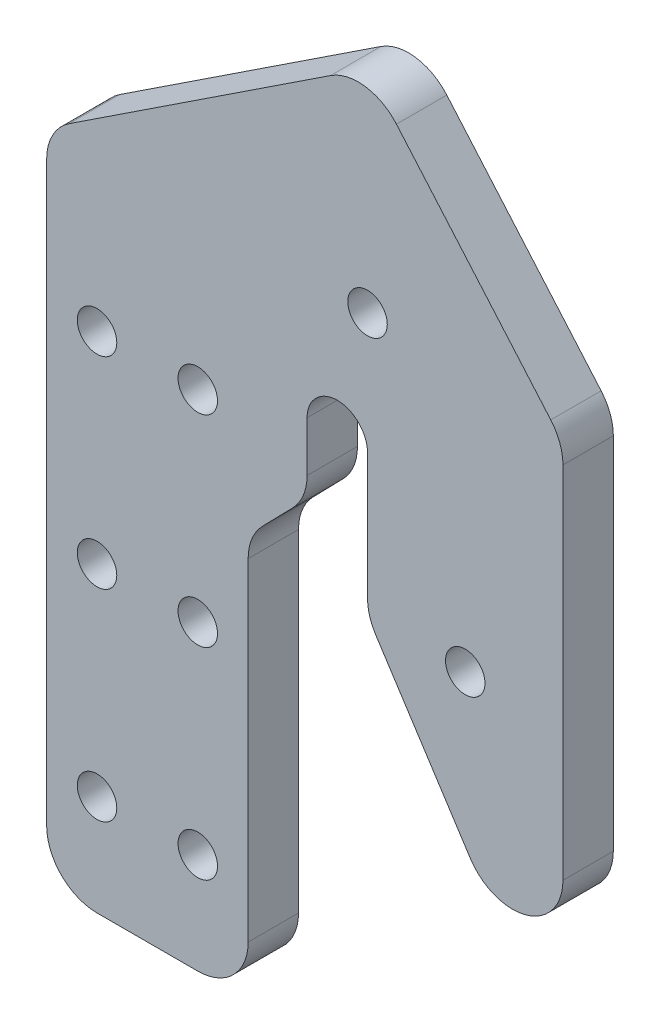
ISO-10303-21;
HEADER;
FILE_DESCRIPTION(('STEP AP214'),'2;1');
FILE_NAME('part.step','',(''),(''),'','','');
FILE_SCHEMA(('AUTOMOTIVE_DESIGN { 1 0 10303 214 1 1 1 1 }'));
ENDSEC;
DATA;
#1=APPLICATION_CONTEXT('core data for automotive mechanical design processes');
#2=APPLICATION_PROTOCOL_DEFINITION('international standard','automotive_design',2000,#1);
#3=PRODUCT_CONTEXT('',#1,'mechanical');
#4=PRODUCT('Part','Part','',(#3));
#5=PRODUCT_RELATED_PRODUCT_CATEGORY('part','',(#4));
#6=PRODUCT_DEFINITION_FORMATION('','',#4);
#7=PRODUCT_DEFINITION_CONTEXT('part definition',#1,'design');
#8=PRODUCT_DEFINITION('design','',#6,#7);
#9=PRODUCT_DEFINITION_SHAPE('','',#8);
#10=(LENGTH_UNIT() NAMED_UNIT(*) SI_UNIT(.MILLI.,.METRE.));
#11=(NAMED_UNIT(*) PLANE_ANGLE_UNIT() SI_UNIT($,.RADIAN.));
#12=(NAMED_UNIT(*) SI_UNIT($,.STERADIAN.) SOLID_ANGLE_UNIT());
#13=UNCERTAINTY_MEASURE_WITH_UNIT(LENGTH_MEASURE(1.E-05),#10,'distance_accuracy_value','');
#14=(GEOMETRIC_REPRESENTATION_CONTEXT(3) GLOBAL_UNCERTAINTY_ASSIGNED_CONTEXT((#13)) GLOBAL_UNIT_ASSIGNED_CONTEXT((#10,
#11,#12)) REPRESENTATION_CONTEXT('',''));
#15=CARTESIAN_POINT('',(0.,0.,0.));
#16=DIRECTION('',(0.,0.,1.));
#17=DIRECTION('',(1.,0.,0.));
#18=AXIS2_PLACEMENT_3D('',#15,#16,#17);
#19=CARTESIAN_POINT('',(0.,879.362720587149,6.35));
#20=DIRECTION('',(0.,1.,0.));
#21=DIRECTION('',(0.,0.,1.));
#22=AXIS2_PLACEMENT_3D('',#19,#20,#21);
#23=PLANE('',#22);
#24=DIRECTION('',(1.,0.,0.));
#25=VECTOR('',#24,1.);
#26=CARTESIAN_POINT('',(0.,879.362720587149,0.));
#27=LINE('',#26,#25);
#28=CARTESIAN_POINT('',(19.0500000000001,879.362720587149,0.));
#29=VERTEX_POINT('',#28);
#30=CARTESIAN_POINT('',(31.7500000000005,879.362720587149,0.));
#31=VERTEX_POINT('',#30);
#32=EDGE_CURVE('E247',#29,#31,#27,.T.);
#33=ORIENTED_EDGE('',*,*,#32,.T.);
#34=DIRECTION('',(0.,0.,-1.));
#35=VECTOR('',#34,1.);
#36=CARTESIAN_POINT('',(31.7500000000005,879.362720587149,6.35));
#37=LINE('',#36,#35);
#38=CARTESIAN_POINT('',(31.7500000000005,879.362720587149,6.35));
#39=VERTEX_POINT('',#38);
#40=EDGE_CURVE('E325',#31,#39,#37,.F.);
#41=ORIENTED_EDGE('',*,*,#40,.T.);
#42=DIRECTION('',(1.,0.,0.));
#43=VECTOR('',#42,1.);
#44=CARTESIAN_POINT('',(0.,879.362720587149,6.35));
#45=LINE('',#44,#43);
#46=CARTESIAN_POINT('',(19.0500000000001,879.362720587149,6.35));
#47=VERTEX_POINT('',#46);
#48=EDGE_CURVE('E300',#47,#39,#45,.T.);
#49=ORIENTED_EDGE('',*,*,#48,.F.);
#50=DIRECTION('',(0.,0.,-1.));
#51=VECTOR('',#50,1.);
#52=CARTESIAN_POINT('',(19.0500000000001,879.362720587149,6.35));
#53=LINE('',#52,#51);
#54=EDGE_CURVE('E322',#47,#29,#53,.T.);
#55=ORIENTED_EDGE('',*,*,#54,.T.);
#56=EDGE_LOOP('',(#33,#41,#49,#55));
#57=FACE_BOUND('',#56,.T.);
#58=ADVANCED_FACE('F39',(#57),#23,.F.);
#59=CARTESIAN_POINT('',(38.1000000000092,3.7470027081108E-13,6.35));
#60=DIRECTION('',(1.,0.,0.));
#61=DIRECTION('',(0.,1.,0.));
#62=AXIS2_PLACEMENT_3D('',#59,#60,#61);
#63=PLANE('',#62);
#64=DIRECTION('',(0.,-1.,0.));
#65=VECTOR('',#64,1.);
#66=CARTESIAN_POINT('',(38.1000000000092,3.7470027081108E-13,6.35));
#67=LINE('',#66,#65);
#68=CARTESIAN_POINT('',(38.1000000000001,927.579424839047,6.35));
#69=VERTEX_POINT('',#68);
#70=CARTESIAN_POINT('',(38.1000000000005,885.712720587149,6.35));
#71=VERTEX_POINT('',#70);
#72=EDGE_CURVE('E389',#69,#71,#67,.T.);
#73=ORIENTED_EDGE('',*,*,#72,.T.);
#74=DIRECTION('',(0.,0.,-1.));
#75=VECTOR('',#74,1.);
#76=CARTESIAN_POINT('',(38.1000000000005,885.712720587149,0.));
#77=LINE('',#76,#75);
#78=CARTESIAN_POINT('',(38.1000000000005,885.712720587149,0.));
#79=VERTEX_POINT('',#78);
#80=EDGE_CURVE('E303',#71,#79,#77,.T.);
#81=ORIENTED_EDGE('',*,*,#80,.T.);
#82=DIRECTION('',(0.,-1.,0.));
#83=VECTOR('',#82,1.);
#84=CARTESIAN_POINT('',(38.1000000000092,3.7470027081108E-13,0.));
#85=LINE('',#84,#83);
#86=CARTESIAN_POINT('',(38.1000000000001,927.579424839047,0.));
#87=VERTEX_POINT('',#86);
#88=EDGE_CURVE('E250',#87,#79,#85,.T.);
#89=ORIENTED_EDGE('',*,*,#88,.F.);
#90=DIRECTION('',(0.,0.,-1.));
#91=VECTOR('',#90,1.);
#92=CARTESIAN_POINT('',(38.1000000000001,927.579424839047,6.35));
#93=LINE('',#92,#91);
#94=EDGE_CURVE('E200',#87,#69,#93,.F.);
#95=ORIENTED_EDGE('',*,*,#94,.T.);
#96=EDGE_LOOP('',(#73,#81,#89,#95));
#97=FACE_BOUND('',#96,.T.);
#98=ADVANCED_FACE('F383',(#97),#63,.T.);
#99=CARTESIAN_POINT('',(-445.400142299249,434.265138741784,6.35));
#100=DIRECTION('',(-0.716000139620028,0.698100136129553,0.));
#101=DIRECTION('',(-0.698100136129553,-0.716000139620028,0.));
#102=AXIS2_PLACEMENT_3D('',#99,#100,#101);
#103=PLANE('',#102);
#104=DIRECTION('',(0.698100136129553,0.716000139620028,0.));
#105=VECTOR('',#104,1.);
#106=CARTESIAN_POINT('',(-445.400142299249,434.265138741784,6.35));
#107=LINE('',#106,#105);
#108=CARTESIAN_POINT('',(39.9033991134131,932.01236070347,6.35));
#109=VERTEX_POINT('',#108);
#110=CARTESIAN_POINT('',(43.7261008865876,935.933080470828,6.35));
#111=VERTEX_POINT('',#110);
#112=EDGE_CURVE('E190',#109,#111,#107,.T.);
#113=ORIENTED_EDGE('',*,*,#112,.F.);
#114=DIRECTION('',(0.,0.,-1.));
#115=VECTOR('',#114,1.);
#116=CARTESIAN_POINT('',(39.9033991134131,932.01236070347,6.35));
#117=LINE('',#116,#115);
#118=CARTESIAN_POINT('',(39.9033991134131,932.01236070347,0.));
#119=VERTEX_POINT('',#118);
#120=EDGE_CURVE('E347',#109,#119,#117,.T.);
#121=ORIENTED_EDGE('',*,*,#120,.T.);
#122=DIRECTION('',(0.698100136129553,0.716000139620028,0.));
#123=VECTOR('',#122,1.);
#124=CARTESIAN_POINT('',(-445.400142299249,434.265138741784,0.));
#125=LINE('',#124,#123);
#126=CARTESIAN_POINT('',(43.7261008865876,935.933080470828,0.));
#127=VERTEX_POINT('',#126);
#128=EDGE_CURVE('E253',#119,#127,#125,.T.);
#129=ORIENTED_EDGE('',*,*,#128,.T.);
#130=DIRECTION('',(0.,0.,-1.));
#131=VECTOR('',#130,1.);
#132=CARTESIAN_POINT('',(43.7261008865876,935.933080470828,6.35));
#133=LINE('',#132,#131);
#134=EDGE_CURVE('E345',#127,#111,#133,.F.);
#135=ORIENTED_EDGE('',*,*,#134,.T.);
#136=EDGE_LOOP('',(#113,#121,#129,#135));
#137=FACE_BOUND('',#136,.T.);
#138=ADVANCED_FACE('F391',(#137),#103,.F.);
#139=CARTESIAN_POINT('',(45.5295000000003,0.,6.35));
#140=DIRECTION('',(-1.,0.,0.));
#141=DIRECTION('',(0.,0.,1.));
#142=AXIS2_PLACEMENT_3D('',#139,#140,#141);
#143=PLANE('',#142);
#144=DIRECTION('',(0.,1.,0.));
#145=VECTOR('',#144,1.);
#146=CARTESIAN_POINT('',(45.5295000000003,0.,6.35));
#147=LINE('',#146,#145);
#148=CARTESIAN_POINT('',(45.5295000000003,940.36601633525,6.35));
#149=VERTEX_POINT('',#148);
#150=CARTESIAN_POINT('',(45.5295000000003,946.672720587149,6.35));
#151=VERTEX_POINT('',#150);
#152=EDGE_CURVE('E176',#149,#151,#147,.T.);
#153=ORIENTED_EDGE('',*,*,#152,.F.);
#154=DIRECTION('',(0.,0.,-1.));
#155=VECTOR('',#154,1.);
#156=CARTESIAN_POINT('',(45.5295000000003,940.36601633525,6.35));
#157=LINE('',#156,#155);
#158=CARTESIAN_POINT('',(45.5295000000003,940.36601633525,0.));
#159=VERTEX_POINT('',#158);
#160=EDGE_CURVE('E350',#149,#159,#157,.T.);
#161=ORIENTED_EDGE('',*,*,#160,.T.);
#162=DIRECTION('',(0.,1.,0.));
#163=VECTOR('',#162,1.);
#164=CARTESIAN_POINT('',(45.5295000000003,0.,0.));
#165=LINE('',#164,#163);
#166=CARTESIAN_POINT('',(45.5295000000003,946.672720587149,0.));
#167=VERTEX_POINT('',#166);
#168=EDGE_CURVE('E196',#159,#167,#165,.T.);
#169=ORIENTED_EDGE('',*,*,#168,.T.);
#170=DIRECTION('',(0.,0.,-1.));
#171=VECTOR('',#170,1.);
#172=CARTESIAN_POINT('',(45.5295000000003,946.672720587149,6.35));
#173=LINE('',#172,#171);
#174=EDGE_CURVE('E193',#151,#167,#173,.T.);
#175=ORIENTED_EDGE('',*,*,#174,.F.);
#176=EDGE_LOOP('',(#153,#161,#169,#175));
#177=FACE_BOUND('',#176,.T.);
#178=ADVANCED_FACE('F194',(#177),#143,.F.);
#179=CARTESIAN_POINT('',(49.3395000000003,946.672720587149,6.35));
#180=DIRECTION('',(0.,0.,-1.));
#181=DIRECTION('',(-1.,0.,0.));
#182=AXIS2_PLACEMENT_3D('',#179,#180,#181);
#183=CYLINDRICAL_SURFACE('',#182,3.80999999999999);
#184=CARTESIAN_POINT('',(49.3395000000003,946.672720587149,0.));
#185=DIRECTION('',(0.,0.,1.));
#186=DIRECTION('',(1.,0.,0.));
#187=AXIS2_PLACEMENT_3D('',#184,#185,#186);
#188=CIRCLE('',#187,3.80999999999999);
#189=CARTESIAN_POINT('',(53.1495000000003,946.672720587149,0.));
#190=VERTEX_POINT('',#189);
#191=EDGE_CURVE('E257',#190,#167,#188,.T.);
#192=ORIENTED_EDGE('',*,*,#191,.F.);
#193=DIRECTION('',(0.,0.,-1.));
#194=VECTOR('',#193,1.);
#195=CARTESIAN_POINT('',(53.1495000000003,946.672720587149,6.35));
#196=LINE('',#195,#194);
#197=CARTESIAN_POINT('',(53.1495000000003,946.672720587149,6.35));
#198=VERTEX_POINT('',#197);
#199=EDGE_CURVE('E201',#198,#190,#196,.T.);
#200=ORIENTED_EDGE('',*,*,#199,.F.);
#201=CARTESIAN_POINT('',(49.3395000000003,946.672720587149,6.35));
#202=DIRECTION('',(0.,0.,1.));
#203=DIRECTION('',(1.,0.,0.));
#204=AXIS2_PLACEMENT_3D('',#201,#202,#203);
#205=CIRCLE('',#204,3.80999999999999);
#206=EDGE_CURVE('E183',#198,#151,#205,.T.);
#207=ORIENTED_EDGE('',*,*,#206,.T.);
#208=ORIENTED_EDGE('',*,*,#174,.T.);
#209=EDGE_LOOP('',(#192,#200,#207,#208));
#210=FACE_BOUND('',#209,.T.);
#211=ADVANCED_FACE('F203',(#210),#183,.F.);
#212=CARTESIAN_POINT('',(53.1494999999951,-2.90392709878491E-13,6.35));
#213=DIRECTION('',(1.,0.,0.));
#214=DIRECTION('',(0.,1.,0.));
#215=AXIS2_PLACEMENT_3D('',#212,#213,#214);
#216=PLANE('',#215);
#217=DIRECTION('',(0.,-1.,0.));
#218=VECTOR('',#217,1.);
#219=CARTESIAN_POINT('',(53.1494999999951,-2.90392709878491E-13,0.));
#220=LINE('',#219,#218);
#221=CARTESIAN_POINT('',(53.1495000000002,930.767011750239,0.));
#222=VERTEX_POINT('',#221);
#223=EDGE_CURVE('E259',#190,#222,#220,.T.);
#224=ORIENTED_EDGE('',*,*,#223,.T.);
#225=DIRECTION('',(0.,0.,-1.));
#226=VECTOR('',#225,1.);
#227=CARTESIAN_POINT('',(53.1495000000002,930.767011750239,6.35));
#228=LINE('',#227,#226);
#229=CARTESIAN_POINT('',(53.1495000000002,930.767011750239,6.35));
#230=VERTEX_POINT('',#229);
#231=EDGE_CURVE('E372',#222,#230,#228,.F.);
#232=ORIENTED_EDGE('',*,*,#231,.T.);
#233=DIRECTION('',(0.,-1.,0.));
#234=VECTOR('',#233,1.);
#235=CARTESIAN_POINT('',(53.1494999999951,-2.90392709878491E-13,6.35));
#236=LINE('',#235,#234);
#237=EDGE_CURVE('E205',#198,#230,#236,.T.);
#238=ORIENTED_EDGE('',*,*,#237,.F.);
#239=ORIENTED_EDGE('',*,*,#199,.T.);
#240=EDGE_LOOP('',(#224,#232,#238,#239));
#241=FACE_BOUND('',#240,.T.);
#242=ADVANCED_FACE('F449',(#241),#216,.F.);
#243=CARTESIAN_POINT('',(461.037727115955,298.137730201651,6.35));
#244=DIRECTION('',(0.839720318943274,0.543019139583317,0.));
#245=DIRECTION('',(-0.543019139583317,0.839720318943274,0.));
#246=AXIS2_PLACEMENT_3D('',#243,#244,#245);
#247=PLANE('',#246);
#248=DIRECTION('',(0.543019139583317,-0.839720318943274,0.));
#249=VECTOR('',#248,1.);
#250=CARTESIAN_POINT('',(461.037727115955,298.137730201651,0.));
#251=LINE('',#250,#249);
#252=CARTESIAN_POINT('',(54.1672759747103,927.318840213886,0.));
#253=VERTEX_POINT('',#252);
#254=CARTESIAN_POINT('',(66.1052759747104,908.858015471617,0.));
#255=VERTEX_POINT('',#254);
#256=EDGE_CURVE('E262',#253,#255,#251,.T.);
#257=ORIENTED_EDGE('',*,*,#256,.T.);
#258=DIRECTION('',(0.,0.,-1.));
#259=VECTOR('',#258,1.);
#260=CARTESIAN_POINT('',(66.1052759747105,908.858015471617,6.35));
#261=LINE('',#260,#259);
#262=CARTESIAN_POINT('',(66.1052759747104,908.858015471617,6.35));
#263=VERTEX_POINT('',#262);
#264=EDGE_CURVE('E370',#255,#263,#261,.F.);
#265=ORIENTED_EDGE('',*,*,#264,.T.);
#266=DIRECTION('',(0.543019139583317,-0.839720318943274,0.));
#267=VECTOR('',#266,1.);
#268=CARTESIAN_POINT('',(461.037727115955,298.137730201651,6.35));
#269=LINE('',#268,#267);
#270=CARTESIAN_POINT('',(54.1672759747103,927.318840213886,6.35));
#271=VERTEX_POINT('',#270);
#272=EDGE_CURVE('E207',#271,#263,#269,.T.);
#273=ORIENTED_EDGE('',*,*,#272,.F.);
#274=DIRECTION('',(0.,0.,-1.));
#275=VECTOR('',#274,1.);
#276=CARTESIAN_POINT('',(54.1672759747104,927.318840213885,6.35));
#277=LINE('',#276,#275);
#278=EDGE_CURVE('E367',#271,#253,#277,.T.);
#279=ORIENTED_EDGE('',*,*,#278,.T.);
#280=EDGE_LOOP('',(#257,#265,#273,#279));
#281=FACE_BOUND('',#280,.T.);
#282=ADVANCED_FACE('F441',(#281),#247,.F.);
#283=CARTESIAN_POINT('',(77.7874999999986,-1.40369367505643E-13,6.35));
#284=DIRECTION('',(-1.,0.,0.));
#285=DIRECTION('',(0.,-1.,0.));
#286=AXIS2_PLACEMENT_3D('',#283,#284,#285);
#287=PLANE('',#286);
#288=DIRECTION('',(0.,1.,0.));
#289=VECTOR('',#288,1.);
#290=CARTESIAN_POINT('',(77.7874999999986,-1.40369367505643E-13,0.));
#291=LINE('',#290,#289);
#292=CARTESIAN_POINT('',(77.7875000000003,912.306187007971,0.));
#293=VERTEX_POINT('',#292);
#294=CARTESIAN_POINT('',(77.7875000000003,957.648154554396,0.));
#295=VERTEX_POINT('',#294);
#296=EDGE_CURVE('E265',#293,#295,#291,.T.);
#297=ORIENTED_EDGE('',*,*,#296,.T.);
#298=DIRECTION('',(0.,0.,-1.));
#299=VECTOR('',#298,1.);
#300=CARTESIAN_POINT('',(77.7875000000003,957.648154554396,6.35));
#301=LINE('',#300,#299);
#302=CARTESIAN_POINT('',(77.7875000000003,957.648154554396,6.35));
#303=VERTEX_POINT('',#302);
#304=EDGE_CURVE('E365',#295,#303,#301,.F.);
#305=ORIENTED_EDGE('',*,*,#304,.T.);
#306=DIRECTION('',(0.,1.,0.));
#307=VECTOR('',#306,1.);
#308=CARTESIAN_POINT('',(77.7874999999986,-1.40369367505643E-13,6.35));
#309=LINE('',#308,#307);
#310=CARTESIAN_POINT('',(77.7875000000003,912.306187007971,6.35));
#311=VERTEX_POINT('',#310);
#312=EDGE_CURVE('E213',#311,#303,#309,.T.);
#313=ORIENTED_EDGE('',*,*,#312,.F.);
#314=DIRECTION('',(0.,0.,-1.));
#315=VECTOR('',#314,1.);
#316=CARTESIAN_POINT('',(77.7875000000003,912.306187007971,6.35));
#317=LINE('',#316,#315);
#318=EDGE_CURVE('E362',#311,#293,#317,.T.);
#319=ORIENTED_EDGE('',*,*,#318,.T.);
#320=EDGE_LOOP('',(#297,#305,#313,#319));
#321=FACE_BOUND('',#320,.T.);
#322=ADVANCED_FACE('F432',(#321),#287,.F.);
#323=CARTESIAN_POINT('',(519.395080399374,447.833980433243,6.35));
#324=DIRECTION('',(0.757352557388503,0.653006205037206,0.));
#325=DIRECTION('',(-0.653006205037206,0.757352557388503,0.));
#326=AXIS2_PLACEMENT_3D('',#323,#324,#325);
#327=PLANE('',#326);
#328=DIRECTION('',(0.653006205037206,-0.757352557388503,0.));
#329=VECTOR('',#328,1.);
#330=CARTESIAN_POINT('',(519.395080399374,447.833980433243,0.));
#331=LINE('',#330,#329);
#332=CARTESIAN_POINT('',(56.7942818036482,984.35552519632,0.));
#333=VERTEX_POINT('',#332);
#334=CARTESIAN_POINT('',(76.2466887394173,961.794743956382,0.));
#335=VERTEX_POINT('',#334);
#336=EDGE_CURVE('E268',#333,#335,#331,.T.);
#337=ORIENTED_EDGE('',*,*,#336,.F.);
#338=DIRECTION('',(0.,0.,-1.));
#339=VECTOR('',#338,1.);
#340=CARTESIAN_POINT('',(56.7942818036482,984.35552519632,6.35));
#341=LINE('',#340,#339);
#342=CARTESIAN_POINT('',(56.7942818036482,984.35552519632,6.35));
#343=VERTEX_POINT('',#342);
#344=EDGE_CURVE('E360',#333,#343,#341,.F.);
#345=ORIENTED_EDGE('',*,*,#344,.T.);
#346=DIRECTION('',(0.653006205037206,-0.757352557388503,0.));
#347=VECTOR('',#346,1.);
#348=CARTESIAN_POINT('',(519.395080399374,447.833980433243,6.35));
#349=LINE('',#348,#347);
#350=CARTESIAN_POINT('',(76.2466887394173,961.794743956382,6.35));
#351=VERTEX_POINT('',#350);
#352=EDGE_CURVE('E216',#343,#351,#349,.T.);
#353=ORIENTED_EDGE('',*,*,#352,.T.);
#354=DIRECTION('',(0.,0.,-1.));
#355=VECTOR('',#354,1.);
#356=CARTESIAN_POINT('',(76.2466887394174,961.794743956382,0.));
#357=LINE('',#356,#355);
#358=EDGE_CURVE('E357',#351,#335,#357,.T.);
#359=ORIENTED_EDGE('',*,*,#358,.T.);
#360=EDGE_LOOP('',(#337,#345,#353,#359));
#361=FACE_BOUND('',#360,.T.);
#362=ADVANCED_FACE('F423',(#361),#327,.T.);
#363=CARTESIAN_POINT('',(-438.205829004783,664.612173990589,6.35));
#364=DIRECTION('',(0.550458715596329,-0.834862385321101,0.));
#365=DIRECTION('',(0.834862385321101,0.550458715596329,0.));
#366=AXIS2_PLACEMENT_3D('',#363,#364,#365);
#367=PLANE('',#366);
#368=DIRECTION('',(-0.834862385321101,-0.550458715596329,0.));
#369=VECTOR('',#368,1.);
#370=CARTESIAN_POINT('',(-438.205829004783,664.612173990589,0.));
#371=LINE('',#370,#369);
#372=CARTESIAN_POINT('',(48.4896802201945,985.510311941123,0.));
#373=VERTEX_POINT('',#372);
#374=CARTESIAN_POINT('',(15.5545871559633,963.794865964707,0.));
#375=VERTEX_POINT('',#374);
#376=EDGE_CURVE('E271',#373,#375,#371,.T.);
#377=ORIENTED_EDGE('',*,*,#376,.T.);
#378=DIRECTION('',(0.,0.,-1.));
#379=VECTOR('',#378,1.);
#380=CARTESIAN_POINT('',(15.5545871559633,963.794865964707,6.35));
#381=LINE('',#380,#379);
#382=CARTESIAN_POINT('',(15.5545871559633,963.794865964707,6.35));
#383=VERTEX_POINT('',#382);
#384=EDGE_CURVE('E355',#375,#383,#381,.F.);
#385=ORIENTED_EDGE('',*,*,#384,.T.);
#386=DIRECTION('',(-0.834862385321101,-0.550458715596329,0.));
#387=VECTOR('',#386,1.);
#388=CARTESIAN_POINT('',(-438.205829004783,664.612173990589,6.35));
#389=LINE('',#388,#387);
#390=CARTESIAN_POINT('',(48.4896802201945,985.510311941123,6.35));
#391=VERTEX_POINT('',#390);
#392=EDGE_CURVE('E219',#391,#383,#389,.T.);
#393=ORIENTED_EDGE('',*,*,#392,.F.);
#394=DIRECTION('',(0.,0.,-1.));
#395=VECTOR('',#394,1.);
#396=CARTESIAN_POINT('',(48.4896802201945,985.510311941123,0.));
#397=LINE('',#396,#395);
#398=EDGE_CURVE('E352',#391,#373,#397,.T.);
#399=ORIENTED_EDGE('',*,*,#398,.T.);
#400=EDGE_LOOP('',(#377,#385,#393,#399));
#401=FACE_BOUND('',#400,.T.);
#402=ADVANCED_FACE('F414',(#401),#367,.F.);
#403=CARTESIAN_POINT('',(19.05,892.062720587149,6.35));
#404=DIRECTION('',(0.,0.,-1.));
#405=DIRECTION('',(-1.,0.,0.));
#406=AXIS2_PLACEMENT_3D('',#403,#404,#405);
#407=CYLINDRICAL_SURFACE('',#406,2.48919999999987);
#408=CARTESIAN_POINT('',(19.05,892.062720587149,6.35));
#409=DIRECTION('',(0.,0.,1.));
#410=DIRECTION('',(1.,0.,0.));
#411=AXIS2_PLACEMENT_3D('',#408,#409,#410);
#412=CIRCLE('',#411,2.48919999999987);
#413=CARTESIAN_POINT('',(21.5391999999999,892.062720587149,6.35));
#414=VERTEX_POINT('',#413);
#415=EDGE_CURVE('E241',#414,#414,#412,.T.);
#416=ORIENTED_EDGE('',*,*,#415,.T.);
#417=EDGE_LOOP('',(#416));
#418=FACE_BOUND('',#417,.T.);
#419=CARTESIAN_POINT('',(19.05,892.062720587149,0.));
#420=DIRECTION('',(0.,0.,1.));
#421=DIRECTION('',(1.,0.,0.));
#422=AXIS2_PLACEMENT_3D('',#419,#420,#421);
#423=CIRCLE('',#422,2.48919999999987);
#424=CARTESIAN_POINT('',(21.5391999999999,892.062720587149,0.));
#425=VERTEX_POINT('',#424);
#426=EDGE_CURVE('E294',#425,#425,#423,.T.);
#427=ORIENTED_EDGE('',*,*,#426,.F.);
#428=EDGE_LOOP('',(#427));
#429=FACE_BOUND('',#428,.T.);
#430=ADVANCED_FACE('F584',(#418,#429),#407,.F.);
#431=CARTESIAN_POINT('',(31.75,917.462720587149,6.35));
#432=DIRECTION('',(0.,0.,-1.));
#433=DIRECTION('',(-1.,0.,0.));
#434=AXIS2_PLACEMENT_3D('',#431,#432,#433);
#435=CYLINDRICAL_SURFACE('',#434,2.48919999999991);
#436=CARTESIAN_POINT('',(31.75,917.462720587149,6.35));
#437=DIRECTION('',(0.,0.,1.));
#438=DIRECTION('',(1.,0.,0.));
#439=AXIS2_PLACEMENT_3D('',#436,#437,#438);
#440=CIRCLE('',#439,2.48919999999991);
#441=CARTESIAN_POINT('',(34.2391999999999,917.462720587149,6.35));
#442=VERTEX_POINT('',#441);
#443=EDGE_CURVE('E238',#442,#442,#440,.T.);
#444=ORIENTED_EDGE('',*,*,#443,.T.);
#445=EDGE_LOOP('',(#444));
#446=FACE_BOUND('',#445,.T.);
#447=CARTESIAN_POINT('',(31.75,917.462720587149,0.));
#448=DIRECTION('',(0.,0.,1.));
#449=DIRECTION('',(1.,0.,0.));
#450=AXIS2_PLACEMENT_3D('',#447,#448,#449);
#451=CIRCLE('',#450,2.48919999999991);
#452=CARTESIAN_POINT('',(34.2391999999999,917.462720587149,0.));
#453=VERTEX_POINT('',#452);
#454=EDGE_CURVE('E291',#453,#453,#451,.T.);
#455=ORIENTED_EDGE('',*,*,#454,.F.);
#456=EDGE_LOOP('',(#455));
#457=FACE_BOUND('',#456,.T.);
#458=ADVANCED_FACE('F709',(#446,#457),#435,.F.);
#459=CARTESIAN_POINT('',(65.4685000000003,928.892720587149,6.35));
#460=DIRECTION('',(0.,0.,-1.));
#461=DIRECTION('',(-1.,0.,0.));
#462=AXIS2_PLACEMENT_3D('',#459,#460,#461);
#463=CYLINDRICAL_SURFACE('',#462,2.48920000000014);
#464=CARTESIAN_POINT('',(65.4685000000003,928.892720587149,6.35));
#465=DIRECTION('',(0.,0.,1.));
#466=DIRECTION('',(1.,0.,0.));
#467=AXIS2_PLACEMENT_3D('',#464,#465,#466);
#468=CIRCLE('',#467,2.48920000000014);
#469=CARTESIAN_POINT('',(67.9577000000005,928.892720587149,6.35));
#470=VERTEX_POINT('',#469);
#471=EDGE_CURVE('E235',#470,#470,#468,.T.);
#472=ORIENTED_EDGE('',*,*,#471,.T.);
#473=EDGE_LOOP('',(#472));
#474=FACE_BOUND('',#473,.T.);
#475=CARTESIAN_POINT('',(65.4685000000003,928.892720587149,0.));
#476=DIRECTION('',(0.,0.,1.));
#477=DIRECTION('',(1.,0.,0.));
#478=AXIS2_PLACEMENT_3D('',#475,#476,#477);
#479=CIRCLE('',#478,2.48920000000014);
#480=CARTESIAN_POINT('',(67.9577000000005,928.892720587149,0.));
#481=VERTEX_POINT('',#480);
#482=EDGE_CURVE('E288',#481,#481,#479,.T.);
#483=ORIENTED_EDGE('',*,*,#482,.F.);
#484=EDGE_LOOP('',(#483));
#485=FACE_BOUND('',#484,.T.);
#486=ADVANCED_FACE('F698',(#474,#485),#463,.F.);
#487=CARTESIAN_POINT('',(53.1495000000003,961.912720587149,6.35));
#488=DIRECTION('',(0.,0.,-1.));
#489=DIRECTION('',(-1.,0.,0.));
#490=AXIS2_PLACEMENT_3D('',#487,#488,#489);
#491=CYLINDRICAL_SURFACE('',#490,2.48920000000013);
#492=CARTESIAN_POINT('',(53.1495000000003,961.912720587149,6.35));
#493=DIRECTION('',(0.,0.,1.));
#494=DIRECTION('',(1.,0.,0.));
#495=AXIS2_PLACEMENT_3D('',#492,#493,#494);
#496=CIRCLE('',#495,2.48920000000013);
#497=CARTESIAN_POINT('',(55.6387000000005,961.912720587149,6.35));
#498=VERTEX_POINT('',#497);
#499=EDGE_CURVE('E232',#498,#498,#496,.T.);
#500=ORIENTED_EDGE('',*,*,#499,.T.);
#501=EDGE_LOOP('',(#500));
#502=FACE_BOUND('',#501,.T.);
#503=CARTESIAN_POINT('',(53.1495000000003,961.912720587149,0.));
#504=DIRECTION('',(0.,0.,1.));
#505=DIRECTION('',(1.,0.,0.));
#506=AXIS2_PLACEMENT_3D('',#503,#504,#505);
#507=CIRCLE('',#506,2.48920000000013);
#508=CARTESIAN_POINT('',(55.6387000000005,961.912720587149,0.));
#509=VERTEX_POINT('',#508);
#510=EDGE_CURVE('E285',#509,#509,#507,.T.);
#511=ORIENTED_EDGE('',*,*,#510,.F.);
#512=EDGE_LOOP('',(#511));
#513=FACE_BOUND('',#512,.T.);
#514=ADVANCED_FACE('F687',(#502,#513),#491,.F.);
#515=CARTESIAN_POINT('',(19.05,942.862720587149,6.35));
#516=DIRECTION('',(0.,0.,-1.));
#517=DIRECTION('',(-1.,0.,0.));
#518=AXIS2_PLACEMENT_3D('',#515,#516,#517);
#519=CYLINDRICAL_SURFACE('',#518,2.48919999999988);
#520=CARTESIAN_POINT('',(19.05,942.862720587149,6.35));
#521=DIRECTION('',(0.,0.,1.));
#522=DIRECTION('',(1.,0.,0.));
#523=AXIS2_PLACEMENT_3D('',#520,#521,#522);
#524=CIRCLE('',#523,2.48919999999988);
#525=CARTESIAN_POINT('',(21.5391999999999,942.862720587149,6.35));
#526=VERTEX_POINT('',#525);
#527=EDGE_CURVE('E229',#526,#526,#524,.T.);
#528=ORIENTED_EDGE('',*,*,#527,.T.);
#529=EDGE_LOOP('',(#528));
#530=FACE_BOUND('',#529,.T.);
#531=CARTESIAN_POINT('',(19.05,942.862720587149,0.));
#532=DIRECTION('',(0.,0.,1.));
#533=DIRECTION('',(1.,0.,0.));
#534=AXIS2_PLACEMENT_3D('',#531,#532,#533);
#535=CIRCLE('',#534,2.48919999999988);
#536=CARTESIAN_POINT('',(21.5391999999999,942.862720587149,0.));
#537=VERTEX_POINT('',#536);
#538=EDGE_CURVE('E282',#537,#537,#535,.T.);
#539=ORIENTED_EDGE('',*,*,#538,.F.);
#540=EDGE_LOOP('',(#539));
#541=FACE_BOUND('',#540,.T.);
#542=ADVANCED_FACE('F676',(#530,#541),#519,.F.);
#543=CARTESIAN_POINT('',(31.75,942.862720587149,6.35));
#544=DIRECTION('',(0.,0.,-1.));
#545=DIRECTION('',(-1.,0.,0.));
#546=AXIS2_PLACEMENT_3D('',#543,#544,#545);
#547=CYLINDRICAL_SURFACE('',#546,2.48919999999988);
#548=CARTESIAN_POINT('',(31.75,942.862720587149,6.35));
#549=DIRECTION('',(0.,0.,1.));
#550=DIRECTION('',(1.,0.,0.));
#551=AXIS2_PLACEMENT_3D('',#548,#549,#550);
#552=CIRCLE('',#551,2.48919999999988);
#553=CARTESIAN_POINT('',(34.2391999999999,942.862720587149,6.35));
#554=VERTEX_POINT('',#553);
#555=EDGE_CURVE('E226',#554,#554,#552,.T.);
#556=ORIENTED_EDGE('',*,*,#555,.T.);
#557=EDGE_LOOP('',(#556));
#558=FACE_BOUND('',#557,.T.);
#559=CARTESIAN_POINT('',(31.75,942.862720587149,0.));
#560=DIRECTION('',(0.,0.,1.));
#561=DIRECTION('',(1.,0.,0.));
#562=AXIS2_PLACEMENT_3D('',#559,#560,#561);
#563=CIRCLE('',#562,2.48919999999988);
#564=CARTESIAN_POINT('',(34.2391999999999,942.862720587149,0.));
#565=VERTEX_POINT('',#564);
#566=EDGE_CURVE('E279',#565,#565,#563,.T.);
#567=ORIENTED_EDGE('',*,*,#566,.F.);
#568=EDGE_LOOP('',(#567));
#569=FACE_BOUND('',#568,.T.);
#570=ADVANCED_FACE('F664',(#558,#569),#547,.F.);
#571=CARTESIAN_POINT('',(19.05,917.462720587149,6.35));
#572=DIRECTION('',(0.,0.,-1.));
#573=DIRECTION('',(-1.,0.,0.));
#574=AXIS2_PLACEMENT_3D('',#571,#572,#573);
#575=CYLINDRICAL_SURFACE('',#574,2.48919999999988);
#576=CARTESIAN_POINT('',(19.05,917.462720587149,6.35));
#577=DIRECTION('',(0.,0.,1.));
#578=DIRECTION('',(1.,0.,0.));
#579=AXIS2_PLACEMENT_3D('',#576,#577,#578);
#580=CIRCLE('',#579,2.48919999999988);
#581=CARTESIAN_POINT('',(21.5391999999999,917.462720587149,6.35));
#582=VERTEX_POINT('',#581);
#583=EDGE_CURVE('E223',#582,#582,#580,.T.);
#584=ORIENTED_EDGE('',*,*,#583,.T.);
#585=EDGE_LOOP('',(#584));
#586=FACE_BOUND('',#585,.T.);
#587=CARTESIAN_POINT('',(19.05,917.462720587149,0.));
#588=DIRECTION('',(0.,0.,1.));
#589=DIRECTION('',(1.,0.,0.));
#590=AXIS2_PLACEMENT_3D('',#587,#588,#589);
#591=CIRCLE('',#590,2.48919999999988);
#592=CARTESIAN_POINT('',(21.5391999999999,917.462720587149,0.));
#593=VERTEX_POINT('',#592);
#594=EDGE_CURVE('E276',#593,#593,#591,.T.);
#595=ORIENTED_EDGE('',*,*,#594,.F.);
#596=EDGE_LOOP('',(#595));
#597=FACE_BOUND('',#596,.T.);
#598=ADVANCED_FACE('F572',(#586,#597),#575,.F.);
#599=CARTESIAN_POINT('',(12.6999999999999,0.,6.35));
#600=DIRECTION('',(1.,0.,0.));
#601=DIRECTION('',(0.,1.,0.));
#602=AXIS2_PLACEMENT_3D('',#599,#600,#601);
#603=PLANE('',#602);
#604=DIRECTION('',(0.,-1.,0.));
#605=VECTOR('',#604,1.);
#606=CARTESIAN_POINT('',(12.6999999999999,0.,0.));
#607=LINE('',#606,#605);
#608=CARTESIAN_POINT('',(12.7000000000001,958.493489817918,0.));
#609=VERTEX_POINT('',#608);
#610=CARTESIAN_POINT('',(12.7000000000001,885.712720587149,0.));
#611=VERTEX_POINT('',#610);
#612=EDGE_CURVE('E274',#609,#611,#607,.T.);
#613=ORIENTED_EDGE('',*,*,#612,.T.);
#614=DIRECTION('',(0.,0.,-1.));
#615=VECTOR('',#614,1.);
#616=CARTESIAN_POINT('',(12.7000000000001,885.712720587149,6.35));
#617=LINE('',#616,#615);
#618=CARTESIAN_POINT('',(12.7000000000001,885.712720587149,6.35));
#619=VERTEX_POINT('',#618);
#620=EDGE_CURVE('E54',#611,#619,#617,.F.);
#621=ORIENTED_EDGE('',*,*,#620,.T.);
#622=DIRECTION('',(0.,-1.,0.));
#623=VECTOR('',#622,1.);
#624=CARTESIAN_POINT('',(12.6999999999999,0.,6.35));
#625=LINE('',#624,#623);
#626=CARTESIAN_POINT('',(12.7000000000001,958.493489817918,6.35));
#627=VERTEX_POINT('',#626);
#628=EDGE_CURVE('E221',#627,#619,#625,.T.);
#629=ORIENTED_EDGE('',*,*,#628,.F.);
#630=DIRECTION('',(0.,0.,-1.));
#631=VECTOR('',#630,1.);
#632=CARTESIAN_POINT('',(12.7000000000001,958.493489817918,6.35));
#633=LINE('',#632,#631);
#634=EDGE_CURVE('E341',#627,#609,#633,.T.);
#635=ORIENTED_EDGE('',*,*,#634,.T.);
#636=EDGE_LOOP('',(#613,#621,#629,#635));
#637=FACE_BOUND('',#636,.T.);
#638=ADVANCED_FACE('F407',(#637),#603,.F.);
#639=CARTESIAN_POINT('',(31.75,892.062720587149,6.35));
#640=DIRECTION('',(0.,0.,-1.));
#641=DIRECTION('',(-1.,0.,0.));
#642=AXIS2_PLACEMENT_3D('',#639,#640,#641);
#643=CYLINDRICAL_SURFACE('',#642,2.48919999999988);
#644=CARTESIAN_POINT('',(31.75,892.062720587149,6.35));
#645=DIRECTION('',(0.,0.,1.));
#646=DIRECTION('',(1.,0.,0.));
#647=AXIS2_PLACEMENT_3D('',#644,#645,#646);
#648=CIRCLE('',#647,2.48919999999988);
#649=CARTESIAN_POINT('',(34.2391999999999,892.062720587149,6.35));
#650=VERTEX_POINT('',#649);
#651=EDGE_CURVE('E244',#650,#650,#648,.T.);
#652=ORIENTED_EDGE('',*,*,#651,.T.);
#653=EDGE_LOOP('',(#652));
#654=FACE_BOUND('',#653,.T.);
#655=CARTESIAN_POINT('',(31.75,892.062720587149,0.));
#656=DIRECTION('',(0.,0.,1.));
#657=DIRECTION('',(1.,0.,0.));
#658=AXIS2_PLACEMENT_3D('',#655,#656,#657);
#659=CIRCLE('',#658,2.48919999999988);
#660=CARTESIAN_POINT('',(34.2391999999999,892.062720587149,0.));
#661=VERTEX_POINT('',#660);
#662=EDGE_CURVE('E297',#661,#661,#659,.T.);
#663=ORIENTED_EDGE('',*,*,#662,.F.);
#664=EDGE_LOOP('',(#663));
#665=FACE_BOUND('',#664,.T.);
#666=ADVANCED_FACE('F560',(#654,#665),#643,.F.);
#667=CARTESIAN_POINT('',(0.,0.,6.35));
#668=DIRECTION('',(0.,0.,1.));
#669=DIRECTION('',(1.,0.,0.));
#670=AXIS2_PLACEMENT_3D('',#667,#668,#669);
#671=PLANE('',#670);
#672=ORIENTED_EDGE('',*,*,#48,.T.);
#673=CARTESIAN_POINT('',(31.7500000000005,885.712720587149,6.35));
#674=DIRECTION('',(0.,0.,1.));
#675=DIRECTION('',(1.,0.,0.));
#676=AXIS2_PLACEMENT_3D('',#673,#674,#675);
#677=CIRCLE('',#676,6.35);
#678=EDGE_CURVE('E339',#39,#71,#677,.T.);
#679=ORIENTED_EDGE('',*,*,#678,.T.);
#680=ORIENTED_EDGE('',*,*,#72,.F.);
#681=CARTESIAN_POINT('',(44.4500000000002,927.579424839047,6.35));
#682=DIRECTION('',(0.,0.,1.));
#683=DIRECTION('',(1.,0.,0.));
#684=AXIS2_PLACEMENT_3D('',#681,#682,#683);
#685=CIRCLE('',#684,6.35);
#686=EDGE_CURVE('E11',#69,#109,#685,.F.);
#687=ORIENTED_EDGE('',*,*,#686,.T.);
#688=ORIENTED_EDGE('',*,*,#112,.T.);
#689=CARTESIAN_POINT('',(39.1795000000003,940.36601633525,6.35));
#690=DIRECTION('',(0.,0.,1.));
#691=DIRECTION('',(1.,0.,0.));
#692=AXIS2_PLACEMENT_3D('',#689,#690,#691);
#693=CIRCLE('',#692,6.35);
#694=EDGE_CURVE('E186',#111,#149,#693,.T.);
#695=ORIENTED_EDGE('',*,*,#694,.T.);
#696=ORIENTED_EDGE('',*,*,#152,.T.);
#697=ORIENTED_EDGE('',*,*,#206,.F.);
#698=ORIENTED_EDGE('',*,*,#237,.T.);
#699=CARTESIAN_POINT('',(59.4995000000002,930.767011750239,6.35));
#700=DIRECTION('',(0.,0.,1.));
#701=DIRECTION('',(1.,0.,0.));
#702=AXIS2_PLACEMENT_3D('',#699,#700,#701);
#703=CIRCLE('',#702,6.35);
#704=EDGE_CURVE('E327',#230,#271,#703,.T.);
#705=ORIENTED_EDGE('',*,*,#704,.T.);
#706=ORIENTED_EDGE('',*,*,#272,.T.);
#707=CARTESIAN_POINT('',(71.4375000000003,912.306187007971,6.35));
#708=DIRECTION('',(0.,0.,1.));
#709=DIRECTION('',(1.,0.,0.));
#710=AXIS2_PLACEMENT_3D('',#707,#708,#709);
#711=CIRCLE('',#710,6.35);
#712=EDGE_CURVE('E329',#263,#311,#711,.T.);
#713=ORIENTED_EDGE('',*,*,#712,.T.);
#714=ORIENTED_EDGE('',*,*,#312,.T.);
#715=CARTESIAN_POINT('',(71.4375000000003,957.648154554396,6.35));
#716=DIRECTION('',(0.,0.,1.));
#717=DIRECTION('',(1.,0.,0.));
#718=AXIS2_PLACEMENT_3D('',#715,#716,#717);
#719=CIRCLE('',#718,6.35);
#720=EDGE_CURVE('E331',#303,#351,#719,.T.);
#721=ORIENTED_EDGE('',*,*,#720,.T.);
#722=ORIENTED_EDGE('',*,*,#352,.F.);
#723=CARTESIAN_POINT('',(51.9850930642312,980.208935794334,6.35));
#724=DIRECTION('',(0.,0.,1.));
#725=DIRECTION('',(1.,0.,0.));
#726=AXIS2_PLACEMENT_3D('',#723,#724,#725);
#727=CIRCLE('',#726,6.35);
#728=EDGE_CURVE('E333',#343,#391,#727,.T.);
#729=ORIENTED_EDGE('',*,*,#728,.T.);
#730=ORIENTED_EDGE('',*,*,#392,.T.);
#731=CARTESIAN_POINT('',(19.0500000000001,958.493489817918,6.35));
#732=DIRECTION('',(0.,0.,1.));
#733=DIRECTION('',(1.,0.,0.));
#734=AXIS2_PLACEMENT_3D('',#731,#732,#733);
#735=CIRCLE('',#734,6.35);
#736=EDGE_CURVE('E61',#383,#627,#735,.T.);
#737=ORIENTED_EDGE('',*,*,#736,.T.);
#738=ORIENTED_EDGE('',*,*,#628,.T.);
#739=CARTESIAN_POINT('',(19.0500000000001,885.712720587149,6.35));
#740=DIRECTION('',(0.,0.,1.));
#741=DIRECTION('',(1.,0.,0.));
#742=AXIS2_PLACEMENT_3D('',#739,#740,#741);
#743=CIRCLE('',#742,6.35);
#744=EDGE_CURVE('E337',#619,#47,#743,.T.);
#745=ORIENTED_EDGE('',*,*,#744,.T.);
#746=EDGE_LOOP('',(#672,#679,#680,#687,#688,#695,#696,#697,#698,#705,#706,#713,#714,#721,#722,
#729,#730,#737,#738,#745));
#747=FACE_BOUND('',#746,.T.);
#748=ORIENTED_EDGE('',*,*,#583,.F.);
#749=EDGE_LOOP('',(#748));
#750=FACE_BOUND('',#749,.T.);
#751=ORIENTED_EDGE('',*,*,#555,.F.);
#752=EDGE_LOOP('',(#751));
#753=FACE_BOUND('',#752,.T.);
#754=ORIENTED_EDGE('',*,*,#527,.F.);
#755=EDGE_LOOP('',(#754));
#756=FACE_BOUND('',#755,.T.);
#757=ORIENTED_EDGE('',*,*,#499,.F.);
#758=EDGE_LOOP('',(#757));
#759=FACE_BOUND('',#758,.T.);
#760=ORIENTED_EDGE('',*,*,#471,.F.);
#761=EDGE_LOOP('',(#760));
#762=FACE_BOUND('',#761,.T.);
#763=ORIENTED_EDGE('',*,*,#443,.F.);
#764=EDGE_LOOP('',(#763));
#765=FACE_BOUND('',#764,.T.);
#766=ORIENTED_EDGE('',*,*,#415,.F.);
#767=EDGE_LOOP('',(#766));
#768=FACE_BOUND('',#767,.T.);
#769=ORIENTED_EDGE('',*,*,#651,.F.);
#770=EDGE_LOOP('',(#769));
#771=FACE_BOUND('',#770,.T.);
#772=ADVANCED_FACE('F179',(#747,#750,#753,#756,#759,#762,#765,#768,#771),#671,.T.);
#773=CARTESIAN_POINT('',(0.,0.,0.));
#774=DIRECTION('',(0.,0.,1.));
#775=DIRECTION('',(1.,0.,0.));
#776=AXIS2_PLACEMENT_3D('',#773,#774,#775);
#777=PLANE('',#776);
#778=ORIENTED_EDGE('',*,*,#88,.T.);
#779=CARTESIAN_POINT('',(31.7500000000005,885.712720587149,0.));
#780=DIRECTION('',(0.,0.,1.));
#781=DIRECTION('',(1.,0.,0.));
#782=AXIS2_PLACEMENT_3D('',#779,#780,#781);
#783=CIRCLE('',#782,6.35);
#784=EDGE_CURVE('E320',#79,#31,#783,.F.);
#785=ORIENTED_EDGE('',*,*,#784,.T.);
#786=ORIENTED_EDGE('',*,*,#32,.F.);
#787=CARTESIAN_POINT('',(19.0500000000001,885.712720587149,0.));
#788=DIRECTION('',(0.,0.,1.));
#789=DIRECTION('',(1.,0.,0.));
#790=AXIS2_PLACEMENT_3D('',#787,#788,#789);
#791=CIRCLE('',#790,6.35);
#792=EDGE_CURVE('E318',#29,#611,#791,.F.);
#793=ORIENTED_EDGE('',*,*,#792,.T.);
#794=ORIENTED_EDGE('',*,*,#612,.F.);
#795=CARTESIAN_POINT('',(19.0500000000001,958.493489817918,0.));
#796=DIRECTION('',(0.,0.,1.));
#797=DIRECTION('',(1.,0.,0.));
#798=AXIS2_PLACEMENT_3D('',#795,#796,#797);
#799=CIRCLE('',#798,6.35);
#800=EDGE_CURVE('E314',#609,#375,#799,.F.);
#801=ORIENTED_EDGE('',*,*,#800,.T.);
#802=ORIENTED_EDGE('',*,*,#376,.F.);
#803=CARTESIAN_POINT('',(51.9850930642312,980.208935794334,0.));
#804=DIRECTION('',(0.,0.,1.));
#805=DIRECTION('',(1.,0.,0.));
#806=AXIS2_PLACEMENT_3D('',#803,#804,#805);
#807=CIRCLE('',#806,6.35);
#808=EDGE_CURVE('E312',#373,#333,#807,.F.);
#809=ORIENTED_EDGE('',*,*,#808,.T.);
#810=ORIENTED_EDGE('',*,*,#336,.T.);
#811=CARTESIAN_POINT('',(71.4375000000003,957.648154554396,0.));
#812=DIRECTION('',(0.,0.,1.));
#813=DIRECTION('',(1.,0.,0.));
#814=AXIS2_PLACEMENT_3D('',#811,#812,#813);
#815=CIRCLE('',#814,6.35);
#816=EDGE_CURVE('E310',#335,#295,#815,.F.);
#817=ORIENTED_EDGE('',*,*,#816,.T.);
#818=ORIENTED_EDGE('',*,*,#296,.F.);
#819=CARTESIAN_POINT('',(71.4375000000003,912.306187007971,0.));
#820=DIRECTION('',(0.,0.,1.));
#821=DIRECTION('',(1.,0.,0.));
#822=AXIS2_PLACEMENT_3D('',#819,#820,#821);
#823=CIRCLE('',#822,6.35);
#824=EDGE_CURVE('E308',#293,#255,#823,.F.);
#825=ORIENTED_EDGE('',*,*,#824,.T.);
#826=ORIENTED_EDGE('',*,*,#256,.F.);
#827=CARTESIAN_POINT('',(59.4995000000002,930.767011750239,0.));
#828=DIRECTION('',(0.,0.,1.));
#829=DIRECTION('',(1.,0.,0.));
#830=AXIS2_PLACEMENT_3D('',#827,#828,#829);
#831=CIRCLE('',#830,6.35);
#832=EDGE_CURVE('E306',#253,#222,#831,.F.);
#833=ORIENTED_EDGE('',*,*,#832,.T.);
#834=ORIENTED_EDGE('',*,*,#223,.F.);
#835=ORIENTED_EDGE('',*,*,#191,.T.);
#836=ORIENTED_EDGE('',*,*,#168,.F.);
#837=CARTESIAN_POINT('',(39.1795000000003,940.36601633525,0.));
#838=DIRECTION('',(0.,0.,1.));
#839=DIRECTION('',(1.,0.,0.));
#840=AXIS2_PLACEMENT_3D('',#837,#838,#839);
#841=CIRCLE('',#840,6.35);
#842=EDGE_CURVE('E316',#159,#127,#841,.F.);
#843=ORIENTED_EDGE('',*,*,#842,.T.);
#844=ORIENTED_EDGE('',*,*,#128,.F.);
#845=CARTESIAN_POINT('',(44.4500000000002,927.579424839047,0.));
#846=DIRECTION('',(0.,0.,1.));
#847=DIRECTION('',(1.,0.,0.));
#848=AXIS2_PLACEMENT_3D('',#845,#846,#847);
#849=CIRCLE('',#848,6.35);
#850=EDGE_CURVE('E47',#119,#87,#849,.T.);
#851=ORIENTED_EDGE('',*,*,#850,.T.);
#852=EDGE_LOOP('',(#778,#785,#786,#793,#794,#801,#802,#809,#810,#817,#818,#825,#826,#833,#834,
#835,#836,#843,#844,#851));
#853=FACE_BOUND('',#852,.T.);
#854=ORIENTED_EDGE('',*,*,#594,.T.);
#855=EDGE_LOOP('',(#854));
#856=FACE_BOUND('',#855,.T.);
#857=ORIENTED_EDGE('',*,*,#566,.T.);
#858=EDGE_LOOP('',(#857));
#859=FACE_BOUND('',#858,.T.);
#860=ORIENTED_EDGE('',*,*,#538,.T.);
#861=EDGE_LOOP('',(#860));
#862=FACE_BOUND('',#861,.T.);
#863=ORIENTED_EDGE('',*,*,#510,.T.);
#864=EDGE_LOOP('',(#863));
#865=FACE_BOUND('',#864,.T.);
#866=ORIENTED_EDGE('',*,*,#482,.T.);
#867=EDGE_LOOP('',(#866));
#868=FACE_BOUND('',#867,.T.);
#869=ORIENTED_EDGE('',*,*,#454,.T.);
#870=EDGE_LOOP('',(#869));
#871=FACE_BOUND('',#870,.T.);
#872=ORIENTED_EDGE('',*,*,#426,.T.);
#873=EDGE_LOOP('',(#872));
#874=FACE_BOUND('',#873,.T.);
#875=ORIENTED_EDGE('',*,*,#662,.T.);
#876=EDGE_LOOP('',(#875));
#877=FACE_BOUND('',#876,.T.);
#878=ADVANCED_FACE('F376',(#853,#856,#859,#862,#865,#868,#871,#874,#877),#777,.F.);
#879=CARTESIAN_POINT('',(31.7500000000005,885.712720587149,6.35));
#880=DIRECTION('',(0.,0.,1.));
#881=DIRECTION('',(1.,0.,0.));
#882=AXIS2_PLACEMENT_3D('',#879,#880,#881);
#883=CYLINDRICAL_SURFACE('',#882,6.35);
#884=ORIENTED_EDGE('',*,*,#678,.F.);
#885=ORIENTED_EDGE('',*,*,#40,.F.);
#886=ORIENTED_EDGE('',*,*,#784,.F.);
#887=ORIENTED_EDGE('',*,*,#80,.F.);
#888=EDGE_LOOP('',(#884,#885,#886,#887));
#889=FACE_BOUND('',#888,.T.);
#890=ADVANCED_FACE('F402',(#889),#883,.T.);
#891=CARTESIAN_POINT('',(19.0500000000001,885.712720587149,6.35));
#892=DIRECTION('',(0.,0.,-1.));
#893=DIRECTION('',(-1.,0.,0.));
#894=AXIS2_PLACEMENT_3D('',#891,#892,#893);
#895=CYLINDRICAL_SURFACE('',#894,6.35);
#896=ORIENTED_EDGE('',*,*,#744,.F.);
#897=ORIENTED_EDGE('',*,*,#620,.F.);
#898=ORIENTED_EDGE('',*,*,#792,.F.);
#899=ORIENTED_EDGE('',*,*,#54,.F.);
#900=EDGE_LOOP('',(#896,#897,#898,#899));
#901=FACE_BOUND('',#900,.T.);
#902=ADVANCED_FACE('F405',(#901),#895,.T.);
#903=CARTESIAN_POINT('',(44.4500000000002,927.579424839047,6.35));
#904=DIRECTION('',(0.,0.,-1.));
#905=DIRECTION('',(-1.,0.,0.));
#906=AXIS2_PLACEMENT_3D('',#903,#904,#905);
#907=CYLINDRICAL_SURFACE('',#906,6.35);
#908=ORIENTED_EDGE('',*,*,#686,.F.);
#909=ORIENTED_EDGE('',*,*,#94,.F.);
#910=ORIENTED_EDGE('',*,*,#850,.F.);
#911=ORIENTED_EDGE('',*,*,#120,.F.);
#912=EDGE_LOOP('',(#908,#909,#910,#911));
#913=FACE_BOUND('',#912,.T.);
#914=ADVANCED_FACE('F387',(#913),#907,.F.);
#915=CARTESIAN_POINT('',(39.1795000000003,940.36601633525,6.35));
#916=DIRECTION('',(0.,0.,-1.));
#917=DIRECTION('',(-1.,0.,0.));
#918=AXIS2_PLACEMENT_3D('',#915,#916,#917);
#919=CYLINDRICAL_SURFACE('',#918,6.35);
#920=ORIENTED_EDGE('',*,*,#694,.F.);
#921=ORIENTED_EDGE('',*,*,#134,.F.);
#922=ORIENTED_EDGE('',*,*,#842,.F.);
#923=ORIENTED_EDGE('',*,*,#160,.F.);
#924=EDGE_LOOP('',(#920,#921,#922,#923));
#925=FACE_BOUND('',#924,.T.);
#926=ADVANCED_FACE('F472',(#925),#919,.T.);
#927=CARTESIAN_POINT('',(19.0500000000001,958.493489817918,6.35));
#928=DIRECTION('',(0.,0.,-1.));
#929=DIRECTION('',(-1.,0.,0.));
#930=AXIS2_PLACEMENT_3D('',#927,#928,#929);
#931=CYLINDRICAL_SURFACE('',#930,6.35);
#932=ORIENTED_EDGE('',*,*,#736,.F.);
#933=ORIENTED_EDGE('',*,*,#384,.F.);
#934=ORIENTED_EDGE('',*,*,#800,.F.);
#935=ORIENTED_EDGE('',*,*,#634,.F.);
#936=EDGE_LOOP('',(#932,#933,#934,#935));
#937=FACE_BOUND('',#936,.T.);
#938=ADVANCED_FACE('F410',(#937),#931,.T.);
#939=CARTESIAN_POINT('',(51.9850930642312,980.208935794334,6.35));
#940=DIRECTION('',(0.,0.,1.));
#941=DIRECTION('',(1.,0.,0.));
#942=AXIS2_PLACEMENT_3D('',#939,#940,#941);
#943=CYLINDRICAL_SURFACE('',#942,6.35);
#944=ORIENTED_EDGE('',*,*,#728,.F.);
#945=ORIENTED_EDGE('',*,*,#344,.F.);
#946=ORIENTED_EDGE('',*,*,#808,.F.);
#947=ORIENTED_EDGE('',*,*,#398,.F.);
#948=EDGE_LOOP('',(#944,#945,#946,#947));
#949=FACE_BOUND('',#948,.T.);
#950=ADVANCED_FACE('F419',(#949),#943,.T.);
#951=CARTESIAN_POINT('',(71.4375000000003,957.648154554396,6.35));
#952=DIRECTION('',(0.,0.,1.));
#953=DIRECTION('',(1.,0.,0.));
#954=AXIS2_PLACEMENT_3D('',#951,#952,#953);
#955=CYLINDRICAL_SURFACE('',#954,6.35);
#956=ORIENTED_EDGE('',*,*,#720,.F.);
#957=ORIENTED_EDGE('',*,*,#304,.F.);
#958=ORIENTED_EDGE('',*,*,#816,.F.);
#959=ORIENTED_EDGE('',*,*,#358,.F.);
#960=EDGE_LOOP('',(#956,#957,#958,#959));
#961=FACE_BOUND('',#960,.T.);
#962=ADVANCED_FACE('F428',(#961),#955,.T.);
#963=CARTESIAN_POINT('',(71.4375000000003,912.306187007971,6.35));
#964=DIRECTION('',(0.,0.,-1.));
#965=DIRECTION('',(-1.,0.,0.));
#966=AXIS2_PLACEMENT_3D('',#963,#964,#965);
#967=CYLINDRICAL_SURFACE('',#966,6.35);
#968=ORIENTED_EDGE('',*,*,#712,.F.);
#969=ORIENTED_EDGE('',*,*,#264,.F.);
#970=ORIENTED_EDGE('',*,*,#824,.F.);
#971=ORIENTED_EDGE('',*,*,#318,.F.);
#972=EDGE_LOOP('',(#968,#969,#970,#971));
#973=FACE_BOUND('',#972,.T.);
#974=ADVANCED_FACE('F437',(#973),#967,.T.);
#975=CARTESIAN_POINT('',(59.4995000000002,930.767011750239,6.35));
#976=DIRECTION('',(0.,0.,-1.));
#977=DIRECTION('',(-1.,0.,0.));
#978=AXIS2_PLACEMENT_3D('',#975,#976,#977);
#979=CYLINDRICAL_SURFACE('',#978,6.35);
#980=ORIENTED_EDGE('',*,*,#704,.F.);
#981=ORIENTED_EDGE('',*,*,#231,.F.);
#982=ORIENTED_EDGE('',*,*,#832,.F.);
#983=ORIENTED_EDGE('',*,*,#278,.F.);
#984=EDGE_LOOP('',(#980,#981,#982,#983));
#985=FACE_BOUND('',#984,.T.);
#986=ADVANCED_FACE('F41',(#985),#979,.T.);
#987=CLOSED_SHELL('',(#58,#98,#138,#178,#211,#242,#282,#322,#362,#402,#430,#458,#486,#514,#542,
#570,#598,#638,#666,#772,#878,#890,#902,#914,#926,#938,#950,#962,#974,#986));
#988=MANIFOLD_SOLID_BREP('B2',#987);
#989=ADVANCED_BREP_SHAPE_REPRESENTATION('',(#18,#988),#14);
#990=SHAPE_DEFINITION_REPRESENTATION(#9,#989);
ENDSEC;
END-ISO-10303-21;
